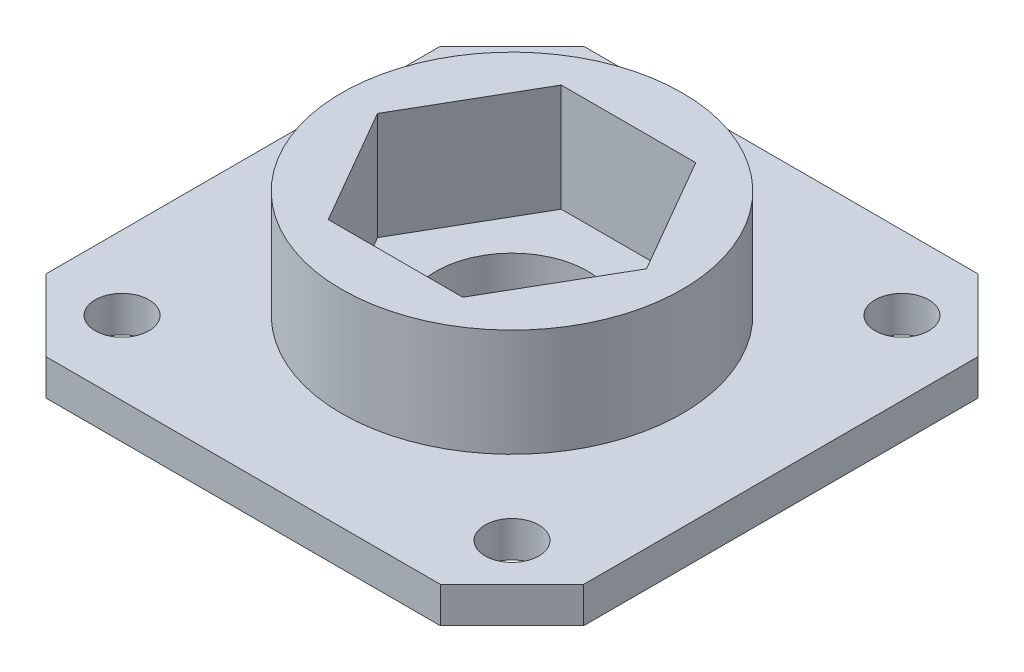
ISO-10303-21;
HEADER;
FILE_DESCRIPTION(('STEP AP214'),'2;1');
FILE_NAME('part.step','',(''),(''),'','','');
FILE_SCHEMA(('AUTOMOTIVE_DESIGN { 1 0 10303 214 1 1 1 1 }'));
ENDSEC;
DATA;
#1=APPLICATION_CONTEXT('core data for automotive mechanical design processes');
#2=APPLICATION_PROTOCOL_DEFINITION('international standard','automotive_design',2000,#1);
#3=PRODUCT_CONTEXT('',#1,'mechanical');
#4=PRODUCT('Part','Part','',(#3));
#5=PRODUCT_RELATED_PRODUCT_CATEGORY('part','',(#4));
#6=PRODUCT_DEFINITION_FORMATION('','',#4);
#7=PRODUCT_DEFINITION_CONTEXT('part definition',#1,'design');
#8=PRODUCT_DEFINITION('design','',#6,#7);
#9=PRODUCT_DEFINITION_SHAPE('','',#8);
#10=(LENGTH_UNIT() NAMED_UNIT(*) SI_UNIT(.MILLI.,.METRE.));
#11=(NAMED_UNIT(*) PLANE_ANGLE_UNIT() SI_UNIT($,.RADIAN.));
#12=(NAMED_UNIT(*) SI_UNIT($,.STERADIAN.) SOLID_ANGLE_UNIT());
#13=UNCERTAINTY_MEASURE_WITH_UNIT(LENGTH_MEASURE(1.E-05),#10,'distance_accuracy_value','');
#14=(GEOMETRIC_REPRESENTATION_CONTEXT(3) GLOBAL_UNCERTAINTY_ASSIGNED_CONTEXT((#13)) GLOBAL_UNIT_ASSIGNED_CONTEXT((#10,
#11,#12)) REPRESENTATION_CONTEXT('',''));
#15=CARTESIAN_POINT('',(0.,0.,0.));
#16=DIRECTION('',(0.,0.,1.));
#17=DIRECTION('',(1.,0.,0.));
#18=AXIS2_PLACEMENT_3D('',#15,#16,#17);
#19=CARTESIAN_POINT('',(-15.,2.,-15.));
#20=DIRECTION('',(0.,-1.,0.));
#21=DIRECTION('',(0.,0.,-1.));
#22=AXIS2_PLACEMENT_3D('',#19,#20,#21);
#23=PLANE('',#22);
#24=CARTESIAN_POINT('',(10.8786796564404,2.,-10.8786796564403));
#25=DIRECTION('',(0.,1.,0.));
#26=DIRECTION('',(0.,0.,1.));
#27=AXIS2_PLACEMENT_3D('',#24,#25,#26);
#28=CIRCLE('',#27,1.5);
#29=CARTESIAN_POINT('',(10.8786796564404,2.,-9.37867965644035));
#30=VERTEX_POINT('',#29);
#31=EDGE_CURVE('E211',#30,#30,#28,.T.);
#32=ORIENTED_EDGE('',*,*,#31,.F.);
#33=EDGE_LOOP('',(#32));
#34=FACE_BOUND('',#33,.T.);
#35=CARTESIAN_POINT('',(-10.8786796564403,2.,10.8786796564404));
#36=DIRECTION('',(0.,1.,0.));
#37=DIRECTION('',(0.,0.,1.));
#38=AXIS2_PLACEMENT_3D('',#35,#36,#37);
#39=CIRCLE('',#38,1.5);
#40=CARTESIAN_POINT('',(-10.8786796564403,2.,12.3786796564404));
#41=VERTEX_POINT('',#40);
#42=EDGE_CURVE('E199',#41,#41,#39,.T.);
#43=ORIENTED_EDGE('',*,*,#42,.F.);
#44=EDGE_LOOP('',(#43));
#45=FACE_BOUND('',#44,.T.);
#46=DIRECTION('',(0.,0.,1.));
#47=VECTOR('',#46,1.);
#48=CARTESIAN_POINT('',(-15.,2.,11.));
#49=LINE('',#48,#47);
#50=CARTESIAN_POINT('',(-15.,2.,-11.));
#51=VERTEX_POINT('',#50);
#52=CARTESIAN_POINT('',(-15.,2.,11.));
#53=VERTEX_POINT('',#52);
#54=EDGE_CURVE('E158',#51,#53,#49,.T.);
#55=ORIENTED_EDGE('',*,*,#54,.T.);
#56=DIRECTION('',(0.707106781186548,0.,0.707106781186548));
#57=VECTOR('',#56,1.);
#58=CARTESIAN_POINT('',(-15.,2.,11.));
#59=LINE('',#58,#57);
#60=CARTESIAN_POINT('',(-11.,2.,15.));
#61=VERTEX_POINT('',#60);
#62=EDGE_CURVE('E99',#53,#61,#59,.T.);
#63=ORIENTED_EDGE('',*,*,#62,.T.);
#64=DIRECTION('',(1.,0.,0.));
#65=VECTOR('',#64,1.);
#66=CARTESIAN_POINT('',(-11.,2.,15.));
#67=LINE('',#66,#65);
#68=CARTESIAN_POINT('',(11.,2.,15.));
#69=VERTEX_POINT('',#68);
#70=EDGE_CURVE('E190',#61,#69,#67,.T.);
#71=ORIENTED_EDGE('',*,*,#70,.T.);
#72=DIRECTION('',(0.707106781186548,0.,-0.707106781186547));
#73=VECTOR('',#72,1.);
#74=CARTESIAN_POINT('',(11.,2.,15.));
#75=LINE('',#74,#73);
#76=CARTESIAN_POINT('',(15.,2.,11.));
#77=VERTEX_POINT('',#76);
#78=EDGE_CURVE('E189',#69,#77,#75,.T.);
#79=ORIENTED_EDGE('',*,*,#78,.T.);
#80=DIRECTION('',(0.,0.,-1.));
#81=VECTOR('',#80,1.);
#82=CARTESIAN_POINT('',(15.,2.,11.));
#83=LINE('',#82,#81);
#84=CARTESIAN_POINT('',(15.,2.,-11.));
#85=VERTEX_POINT('',#84);
#86=EDGE_CURVE('E121',#77,#85,#83,.T.);
#87=ORIENTED_EDGE('',*,*,#86,.T.);
#88=DIRECTION('',(-0.707106781186548,0.,-0.707106781186548));
#89=VECTOR('',#88,1.);
#90=CARTESIAN_POINT('',(11.,2.,-15.));
#91=LINE('',#90,#89);
#92=CARTESIAN_POINT('',(11.,2.,-15.));
#93=VERTEX_POINT('',#92);
#94=EDGE_CURVE('E114',#85,#93,#91,.T.);
#95=ORIENTED_EDGE('',*,*,#94,.T.);
#96=DIRECTION('',(-1.,0.,0.));
#97=VECTOR('',#96,1.);
#98=CARTESIAN_POINT('',(-11.,2.,-15.));
#99=LINE('',#98,#97);
#100=CARTESIAN_POINT('',(-11.,2.,-15.));
#101=VERTEX_POINT('',#100);
#102=EDGE_CURVE('E118',#93,#101,#99,.T.);
#103=ORIENTED_EDGE('',*,*,#102,.T.);
#104=DIRECTION('',(-0.707106781186548,0.,0.707106781186548));
#105=VECTOR('',#104,1.);
#106=CARTESIAN_POINT('',(-15.,2.,-11.));
#107=LINE('',#106,#105);
#108=EDGE_CURVE('E57',#101,#51,#107,.T.);
#109=ORIENTED_EDGE('',*,*,#108,.T.);
#110=EDGE_LOOP('',(#55,#63,#71,#79,#87,#95,#103,#109));
#111=FACE_BOUND('',#110,.T.);
#112=CARTESIAN_POINT('',(-10.8786796564403,2.,-10.8786796564403));
#113=DIRECTION('',(0.,1.,0.));
#114=DIRECTION('',(0.,0.,1.));
#115=AXIS2_PLACEMENT_3D('',#112,#113,#114);
#116=CIRCLE('',#115,1.5);
#117=CARTESIAN_POINT('',(-10.8786796564403,2.,-9.37867965644035));
#118=VERTEX_POINT('',#117);
#119=EDGE_CURVE('E205',#118,#118,#116,.T.);
#120=ORIENTED_EDGE('',*,*,#119,.F.);
#121=EDGE_LOOP('',(#120));
#122=FACE_BOUND('',#121,.T.);
#123=CARTESIAN_POINT('',(10.8786796564404,2.,10.8786796564404));
#124=DIRECTION('',(0.,1.,0.));
#125=DIRECTION('',(0.,0.,1.));
#126=AXIS2_PLACEMENT_3D('',#123,#124,#125);
#127=CIRCLE('',#126,1.5);
#128=CARTESIAN_POINT('',(10.8786796564404,2.,12.3786796564404));
#129=VERTEX_POINT('',#128);
#130=EDGE_CURVE('E217',#129,#129,#127,.T.);
#131=ORIENTED_EDGE('',*,*,#130,.F.);
#132=EDGE_LOOP('',(#131));
#133=FACE_BOUND('',#132,.T.);
#134=CARTESIAN_POINT('',(0.,2.,0.));
#135=DIRECTION('',(0.,-1.,0.));
#136=DIRECTION('',(0.,0.,-1.));
#137=AXIS2_PLACEMENT_3D('',#134,#135,#136);
#138=CIRCLE('',#137,9.50000000000001);
#139=CARTESIAN_POINT('',(0.,2.,-9.50000000000001));
#140=VERTEX_POINT('',#139);
#141=EDGE_CURVE('E11',#140,#140,#138,.F.);
#142=ORIENTED_EDGE('',*,*,#141,.F.);
#143=EDGE_LOOP('',(#142));
#144=FACE_BOUND('',#143,.T.);
#145=ADVANCED_FACE('F33',(#34,#45,#111,#122,#133,#144),#23,.F.);
#146=DIRECTION('',(1.,0.,0.));
#147=VECTOR('',#146,1.);
#148=CARTESIAN_POINT('',(-3.75277674973257,2.,6.5));
#149=LINE('',#148,#147);
#150=CARTESIAN_POINT('',(-3.75277674973257,2.,6.5));
#151=VERTEX_POINT('',#150);
#152=CARTESIAN_POINT('',(3.75277674973257,2.,6.50000000000001));
#153=VERTEX_POINT('',#152);
#154=EDGE_CURVE('E245',#151,#153,#149,.T.);
#155=ORIENTED_EDGE('',*,*,#154,.T.);
#156=DIRECTION('',(0.5,0.,-0.866025403784439));
#157=VECTOR('',#156,1.);
#158=CARTESIAN_POINT('',(3.75277674973257,2.,6.5));
#159=LINE('',#158,#157);
#160=CARTESIAN_POINT('',(7.50555349946514,2.,0.));
#161=VERTEX_POINT('',#160);
#162=EDGE_CURVE('E261',#153,#161,#159,.T.);
#163=ORIENTED_EDGE('',*,*,#162,.T.);
#164=DIRECTION('',(-0.5,0.,-0.866025403784438));
#165=VECTOR('',#164,1.);
#166=CARTESIAN_POINT('',(7.50555349946514,2.,0.));
#167=LINE('',#166,#165);
#168=CARTESIAN_POINT('',(3.75277674973257,2.,-6.50000000000001));
#169=VERTEX_POINT('',#168);
#170=EDGE_CURVE('E258',#161,#169,#167,.T.);
#171=ORIENTED_EDGE('',*,*,#170,.T.);
#172=DIRECTION('',(-1.,0.,0.));
#173=VECTOR('',#172,1.);
#174=CARTESIAN_POINT('',(3.75277674973257,2.,-6.50000000000001));
#175=LINE('',#174,#173);
#176=CARTESIAN_POINT('',(-3.75277674973257,2.,-6.5));
#177=VERTEX_POINT('',#176);
#178=EDGE_CURVE('E255',#169,#177,#175,.T.);
#179=ORIENTED_EDGE('',*,*,#178,.T.);
#180=DIRECTION('',(-0.5,0.,0.866025403784439));
#181=VECTOR('',#180,1.);
#182=CARTESIAN_POINT('',(-3.75277674973257,2.,-6.5));
#183=LINE('',#182,#181);
#184=CARTESIAN_POINT('',(-7.50555349946514,2.,0.));
#185=VERTEX_POINT('',#184);
#186=EDGE_CURVE('E252',#177,#185,#183,.T.);
#187=ORIENTED_EDGE('',*,*,#186,.T.);
#188=DIRECTION('',(0.5,0.,0.866025403784438));
#189=VECTOR('',#188,1.);
#190=CARTESIAN_POINT('',(-7.50555349946514,2.,0.));
#191=LINE('',#190,#189);
#192=EDGE_CURVE('E249',#185,#151,#191,.T.);
#193=ORIENTED_EDGE('',*,*,#192,.T.);
#194=EDGE_LOOP('',(#155,#163,#171,#179,#187,#193));
#195=FACE_BOUND('',#194,.T.);
#196=CARTESIAN_POINT('',(0.,2.,0.));
#197=DIRECTION('',(0.,1.,0.));
#198=DIRECTION('',(0.,0.,1.));
#199=AXIS2_PLACEMENT_3D('',#196,#197,#198);
#200=CIRCLE('',#199,4.25);
#201=CARTESIAN_POINT('',(0.,2.,4.25));
#202=VERTEX_POINT('',#201);
#203=EDGE_CURVE('E146',#202,#202,#200,.T.);
#204=ORIENTED_EDGE('',*,*,#203,.F.);
#205=EDGE_LOOP('',(#204));
#206=FACE_BOUND('',#205,.T.);
#207=ADVANCED_FACE('F317',(#195,#206),#23,.F.);
#208=CARTESIAN_POINT('',(-15.,0.,-15.));
#209=DIRECTION('',(0.,-1.,0.));
#210=DIRECTION('',(0.,0.,-1.));
#211=AXIS2_PLACEMENT_3D('',#208,#209,#210);
#212=PLANE('',#211);
#213=CARTESIAN_POINT('',(10.8786796564404,0.,-10.8786796564403));
#214=DIRECTION('',(0.,1.,0.));
#215=DIRECTION('',(0.,0.,1.));
#216=AXIS2_PLACEMENT_3D('',#213,#214,#215);
#217=CIRCLE('',#216,1.5);
#218=CARTESIAN_POINT('',(10.8786796564404,0.,-9.37867965644035));
#219=VERTEX_POINT('',#218);
#220=EDGE_CURVE('E214',#219,#219,#217,.T.);
#221=ORIENTED_EDGE('',*,*,#220,.T.);
#222=EDGE_LOOP('',(#221));
#223=FACE_BOUND('',#222,.T.);
#224=CARTESIAN_POINT('',(-10.8786796564403,0.,10.8786796564404));
#225=DIRECTION('',(0.,1.,0.));
#226=DIRECTION('',(0.,0.,1.));
#227=AXIS2_PLACEMENT_3D('',#224,#225,#226);
#228=CIRCLE('',#227,1.5);
#229=CARTESIAN_POINT('',(-10.8786796564403,0.,12.3786796564404));
#230=VERTEX_POINT('',#229);
#231=EDGE_CURVE('E202',#230,#230,#228,.T.);
#232=ORIENTED_EDGE('',*,*,#231,.T.);
#233=EDGE_LOOP('',(#232));
#234=FACE_BOUND('',#233,.T.);
#235=DIRECTION('',(0.,0.,1.));
#236=VECTOR('',#235,1.);
#237=CARTESIAN_POINT('',(-15.,0.,11.));
#238=LINE('',#237,#236);
#239=CARTESIAN_POINT('',(-15.,0.,-11.));
#240=VERTEX_POINT('',#239);
#241=CARTESIAN_POINT('',(-15.,0.,11.));
#242=VERTEX_POINT('',#241);
#243=EDGE_CURVE('E142',#240,#242,#238,.T.);
#244=ORIENTED_EDGE('',*,*,#243,.F.);
#245=DIRECTION('',(-0.707106781186548,0.,0.707106781186548));
#246=VECTOR('',#245,1.);
#247=CARTESIAN_POINT('',(-15.,0.,-11.));
#248=LINE('',#247,#246);
#249=CARTESIAN_POINT('',(-11.,0.,-15.));
#250=VERTEX_POINT('',#249);
#251=EDGE_CURVE('E90',#250,#240,#248,.T.);
#252=ORIENTED_EDGE('',*,*,#251,.F.);
#253=DIRECTION('',(-1.,0.,0.));
#254=VECTOR('',#253,1.);
#255=CARTESIAN_POINT('',(-11.,0.,-15.));
#256=LINE('',#255,#254);
#257=CARTESIAN_POINT('',(11.,0.,-15.));
#258=VERTEX_POINT('',#257);
#259=EDGE_CURVE('E155',#258,#250,#256,.T.);
#260=ORIENTED_EDGE('',*,*,#259,.F.);
#261=DIRECTION('',(-0.707106781186548,0.,-0.707106781186548));
#262=VECTOR('',#261,1.);
#263=CARTESIAN_POINT('',(11.,0.,-15.));
#264=LINE('',#263,#262);
#265=CARTESIAN_POINT('',(15.,0.,-11.));
#266=VERTEX_POINT('',#265);
#267=EDGE_CURVE('E130',#266,#258,#264,.T.);
#268=ORIENTED_EDGE('',*,*,#267,.F.);
#269=DIRECTION('',(0.,0.,-1.));
#270=VECTOR('',#269,1.);
#271=CARTESIAN_POINT('',(15.,0.,11.));
#272=LINE('',#271,#270);
#273=CARTESIAN_POINT('',(15.,0.,11.));
#274=VERTEX_POINT('',#273);
#275=EDGE_CURVE('E152',#274,#266,#272,.T.);
#276=ORIENTED_EDGE('',*,*,#275,.F.);
#277=DIRECTION('',(0.707106781186548,0.,-0.707106781186547));
#278=VECTOR('',#277,1.);
#279=CARTESIAN_POINT('',(11.,0.,15.));
#280=LINE('',#279,#278);
#281=CARTESIAN_POINT('',(11.,0.,15.));
#282=VERTEX_POINT('',#281);
#283=EDGE_CURVE('E150',#282,#274,#280,.T.);
#284=ORIENTED_EDGE('',*,*,#283,.F.);
#285=DIRECTION('',(1.,0.,0.));
#286=VECTOR('',#285,1.);
#287=CARTESIAN_POINT('',(-11.,0.,15.));
#288=LINE('',#287,#286);
#289=CARTESIAN_POINT('',(-11.,0.,15.));
#290=VERTEX_POINT('',#289);
#291=EDGE_CURVE('E148',#290,#282,#288,.T.);
#292=ORIENTED_EDGE('',*,*,#291,.F.);
#293=DIRECTION('',(0.707106781186548,0.,0.707106781186548));
#294=VECTOR('',#293,1.);
#295=CARTESIAN_POINT('',(-15.,0.,11.));
#296=LINE('',#295,#294);
#297=EDGE_CURVE('E145',#242,#290,#296,.T.);
#298=ORIENTED_EDGE('',*,*,#297,.F.);
#299=EDGE_LOOP('',(#244,#252,#260,#268,#276,#284,#292,#298));
#300=FACE_BOUND('',#299,.T.);
#301=CARTESIAN_POINT('',(0.,0.,0.));
#302=DIRECTION('',(0.,1.,0.));
#303=DIRECTION('',(0.,0.,1.));
#304=AXIS2_PLACEMENT_3D('',#301,#302,#303);
#305=CIRCLE('',#304,4.25);
#306=CARTESIAN_POINT('',(0.,0.,4.25));
#307=VERTEX_POINT('',#306);
#308=EDGE_CURVE('E196',#307,#307,#305,.T.);
#309=ORIENTED_EDGE('',*,*,#308,.T.);
#310=EDGE_LOOP('',(#309));
#311=FACE_BOUND('',#310,.T.);
#312=CARTESIAN_POINT('',(-10.8786796564403,0.,-10.8786796564403));
#313=DIRECTION('',(0.,1.,0.));
#314=DIRECTION('',(0.,0.,1.));
#315=AXIS2_PLACEMENT_3D('',#312,#313,#314);
#316=CIRCLE('',#315,1.5);
#317=CARTESIAN_POINT('',(-10.8786796564403,0.,-9.37867965644035));
#318=VERTEX_POINT('',#317);
#319=EDGE_CURVE('E208',#318,#318,#316,.T.);
#320=ORIENTED_EDGE('',*,*,#319,.T.);
#321=EDGE_LOOP('',(#320));
#322=FACE_BOUND('',#321,.T.);
#323=CARTESIAN_POINT('',(10.8786796564404,0.,10.8786796564404));
#324=DIRECTION('',(0.,1.,0.));
#325=DIRECTION('',(0.,0.,1.));
#326=AXIS2_PLACEMENT_3D('',#323,#324,#325);
#327=CIRCLE('',#326,1.5);
#328=CARTESIAN_POINT('',(10.8786796564404,0.,12.3786796564404));
#329=VERTEX_POINT('',#328);
#330=EDGE_CURVE('E220',#329,#329,#327,.T.);
#331=ORIENTED_EDGE('',*,*,#330,.T.);
#332=EDGE_LOOP('',(#331));
#333=FACE_BOUND('',#332,.T.);
#334=ADVANCED_FACE('F176',(#223,#234,#300,#311,#322,#333),#212,.T.);
#335=CARTESIAN_POINT('',(-15.,2.,11.));
#336=DIRECTION('',(1.,0.,0.));
#337=DIRECTION('',(0.,0.,-1.));
#338=AXIS2_PLACEMENT_3D('',#335,#336,#337);
#339=PLANE('',#338);
#340=ORIENTED_EDGE('',*,*,#243,.T.);
#341=DIRECTION('',(0.,-1.,0.));
#342=VECTOR('',#341,1.);
#343=CARTESIAN_POINT('',(-15.,2.,11.));
#344=LINE('',#343,#342);
#345=EDGE_CURVE('E41',#53,#242,#344,.T.);
#346=ORIENTED_EDGE('',*,*,#345,.F.);
#347=ORIENTED_EDGE('',*,*,#54,.F.);
#348=DIRECTION('',(0.,-1.,0.));
#349=VECTOR('',#348,1.);
#350=CARTESIAN_POINT('',(-15.,2.,-11.));
#351=LINE('',#350,#349);
#352=EDGE_CURVE('E138',#51,#240,#351,.T.);
#353=ORIENTED_EDGE('',*,*,#352,.T.);
#354=EDGE_LOOP('',(#340,#346,#347,#353));
#355=FACE_BOUND('',#354,.T.);
#356=ADVANCED_FACE('F35',(#355),#339,.F.);
#357=CARTESIAN_POINT('',(-15.,2.,11.));
#358=DIRECTION('',(0.707106781186547,0.,-0.707106781186547));
#359=DIRECTION('',(-0.707106781186548,0.,-0.707106781186548));
#360=AXIS2_PLACEMENT_3D('',#357,#358,#359);
#361=PLANE('',#360);
#362=ORIENTED_EDGE('',*,*,#297,.T.);
#363=DIRECTION('',(0.,-1.,0.));
#364=VECTOR('',#363,1.);
#365=CARTESIAN_POINT('',(-11.,2.,15.));
#366=LINE('',#365,#364);
#367=EDGE_CURVE('E168',#61,#290,#366,.T.);
#368=ORIENTED_EDGE('',*,*,#367,.F.);
#369=ORIENTED_EDGE('',*,*,#62,.F.);
#370=ORIENTED_EDGE('',*,*,#345,.T.);
#371=EDGE_LOOP('',(#362,#368,#369,#370));
#372=FACE_BOUND('',#371,.T.);
#373=ADVANCED_FACE('F171',(#372),#361,.F.);
#374=CARTESIAN_POINT('',(-11.,2.,15.));
#375=DIRECTION('',(0.,0.,-1.));
#376=DIRECTION('',(-1.,0.,0.));
#377=AXIS2_PLACEMENT_3D('',#374,#375,#376);
#378=PLANE('',#377);
#379=ORIENTED_EDGE('',*,*,#291,.T.);
#380=DIRECTION('',(0.,-1.,0.));
#381=VECTOR('',#380,1.);
#382=CARTESIAN_POINT('',(11.,2.,15.));
#383=LINE('',#382,#381);
#384=EDGE_CURVE('E165',#69,#282,#383,.T.);
#385=ORIENTED_EDGE('',*,*,#384,.F.);
#386=ORIENTED_EDGE('',*,*,#70,.F.);
#387=ORIENTED_EDGE('',*,*,#367,.T.);
#388=EDGE_LOOP('',(#379,#385,#386,#387));
#389=FACE_BOUND('',#388,.T.);
#390=ADVANCED_FACE('F183',(#389),#378,.F.);
#391=CARTESIAN_POINT('',(11.,2.,15.));
#392=DIRECTION('',(-0.707106781186547,0.,-0.707106781186548));
#393=DIRECTION('',(-0.707106781186548,0.,0.707106781186547));
#394=AXIS2_PLACEMENT_3D('',#391,#392,#393);
#395=PLANE('',#394);
#396=ORIENTED_EDGE('',*,*,#283,.T.);
#397=DIRECTION('',(0.,-1.,0.));
#398=VECTOR('',#397,1.);
#399=CARTESIAN_POINT('',(15.,2.,11.));
#400=LINE('',#399,#398);
#401=EDGE_CURVE('E162',#77,#274,#400,.T.);
#402=ORIENTED_EDGE('',*,*,#401,.F.);
#403=ORIENTED_EDGE('',*,*,#78,.F.);
#404=ORIENTED_EDGE('',*,*,#384,.T.);
#405=EDGE_LOOP('',(#396,#402,#403,#404));
#406=FACE_BOUND('',#405,.T.);
#407=ADVANCED_FACE('F187',(#406),#395,.F.);
#408=CARTESIAN_POINT('',(15.,2.,11.));
#409=DIRECTION('',(-1.,0.,0.));
#410=DIRECTION('',(0.,0.,1.));
#411=AXIS2_PLACEMENT_3D('',#408,#409,#410);
#412=PLANE('',#411);
#413=ORIENTED_EDGE('',*,*,#275,.T.);
#414=DIRECTION('',(0.,-1.,0.));
#415=VECTOR('',#414,1.);
#416=CARTESIAN_POINT('',(15.,2.,-11.));
#417=LINE('',#416,#415);
#418=EDGE_CURVE('E133',#85,#266,#417,.T.);
#419=ORIENTED_EDGE('',*,*,#418,.F.);
#420=ORIENTED_EDGE('',*,*,#86,.F.);
#421=ORIENTED_EDGE('',*,*,#401,.T.);
#422=EDGE_LOOP('',(#413,#419,#420,#421));
#423=FACE_BOUND('',#422,.T.);
#424=ADVANCED_FACE('F355',(#423),#412,.F.);
#425=CARTESIAN_POINT('',(11.,2.,-15.));
#426=DIRECTION('',(-0.707106781186547,0.,0.707106781186547));
#427=DIRECTION('',(0.707106781186548,0.,0.707106781186548));
#428=AXIS2_PLACEMENT_3D('',#425,#426,#427);
#429=PLANE('',#428);
#430=ORIENTED_EDGE('',*,*,#267,.T.);
#431=DIRECTION('',(0.,-1.,0.));
#432=VECTOR('',#431,1.);
#433=CARTESIAN_POINT('',(11.,2.,-15.));
#434=LINE('',#433,#432);
#435=EDGE_CURVE('E127',#93,#258,#434,.T.);
#436=ORIENTED_EDGE('',*,*,#435,.F.);
#437=ORIENTED_EDGE('',*,*,#94,.F.);
#438=ORIENTED_EDGE('',*,*,#418,.T.);
#439=EDGE_LOOP('',(#430,#436,#437,#438));
#440=FACE_BOUND('',#439,.T.);
#441=ADVANCED_FACE('F128',(#440),#429,.F.);
#442=CARTESIAN_POINT('',(-11.,2.,-15.));
#443=DIRECTION('',(0.,0.,1.));
#444=DIRECTION('',(1.,0.,0.));
#445=AXIS2_PLACEMENT_3D('',#442,#443,#444);
#446=PLANE('',#445);
#447=ORIENTED_EDGE('',*,*,#259,.T.);
#448=DIRECTION('',(0.,-1.,0.));
#449=VECTOR('',#448,1.);
#450=CARTESIAN_POINT('',(-11.,2.,-15.));
#451=LINE('',#450,#449);
#452=EDGE_CURVE('E134',#101,#250,#451,.T.);
#453=ORIENTED_EDGE('',*,*,#452,.F.);
#454=ORIENTED_EDGE('',*,*,#102,.F.);
#455=ORIENTED_EDGE('',*,*,#435,.T.);
#456=EDGE_LOOP('',(#447,#453,#454,#455));
#457=FACE_BOUND('',#456,.T.);
#458=ADVANCED_FACE('F136',(#457),#446,.F.);
#459=CARTESIAN_POINT('',(-15.,2.,-11.));
#460=DIRECTION('',(0.707106781186547,0.,0.707106781186547));
#461=DIRECTION('',(0.707106781186548,0.,-0.707106781186548));
#462=AXIS2_PLACEMENT_3D('',#459,#460,#461);
#463=PLANE('',#462);
#464=ORIENTED_EDGE('',*,*,#251,.T.);
#465=ORIENTED_EDGE('',*,*,#352,.F.);
#466=ORIENTED_EDGE('',*,*,#108,.F.);
#467=ORIENTED_EDGE('',*,*,#452,.T.);
#468=EDGE_LOOP('',(#464,#465,#466,#467));
#469=FACE_BOUND('',#468,.T.);
#470=ADVANCED_FACE('F348',(#469),#463,.F.);
#471=CARTESIAN_POINT('',(0.,2.,0.));
#472=DIRECTION('',(0.,-1.,0.));
#473=DIRECTION('',(0.,0.,-1.));
#474=AXIS2_PLACEMENT_3D('',#471,#472,#473);
#475=CYLINDRICAL_SURFACE('',#474,4.25);
#476=ORIENTED_EDGE('',*,*,#203,.T.);
#477=EDGE_LOOP('',(#476));
#478=FACE_BOUND('',#477,.T.);
#479=ORIENTED_EDGE('',*,*,#308,.F.);
#480=EDGE_LOOP('',(#479));
#481=FACE_BOUND('',#480,.T.);
#482=ADVANCED_FACE('F343',(#478,#481),#475,.F.);
#483=CARTESIAN_POINT('',(-10.8786796564403,2.,10.8786796564404));
#484=DIRECTION('',(0.,-1.,0.));
#485=DIRECTION('',(0.,0.,-1.));
#486=AXIS2_PLACEMENT_3D('',#483,#484,#485);
#487=CYLINDRICAL_SURFACE('',#486,1.5);
#488=ORIENTED_EDGE('',*,*,#42,.T.);
#489=EDGE_LOOP('',(#488));
#490=FACE_BOUND('',#489,.T.);
#491=ORIENTED_EDGE('',*,*,#231,.F.);
#492=EDGE_LOOP('',(#491));
#493=FACE_BOUND('',#492,.T.);
#494=ADVANCED_FACE('F455',(#490,#493),#487,.F.);
#495=CARTESIAN_POINT('',(-10.8786796564403,2.,-10.8786796564403));
#496=DIRECTION('',(0.,-1.,0.));
#497=DIRECTION('',(0.,0.,-1.));
#498=AXIS2_PLACEMENT_3D('',#495,#496,#497);
#499=CYLINDRICAL_SURFACE('',#498,1.5);
#500=ORIENTED_EDGE('',*,*,#119,.T.);
#501=EDGE_LOOP('',(#500));
#502=FACE_BOUND('',#501,.T.);
#503=ORIENTED_EDGE('',*,*,#319,.F.);
#504=EDGE_LOOP('',(#503));
#505=FACE_BOUND('',#504,.T.);
#506=ADVANCED_FACE('F452',(#502,#505),#499,.F.);
#507=CARTESIAN_POINT('',(10.8786796564404,2.,-10.8786796564403));
#508=DIRECTION('',(0.,-1.,0.));
#509=DIRECTION('',(0.,0.,-1.));
#510=AXIS2_PLACEMENT_3D('',#507,#508,#509);
#511=CYLINDRICAL_SURFACE('',#510,1.5);
#512=ORIENTED_EDGE('',*,*,#31,.T.);
#513=EDGE_LOOP('',(#512));
#514=FACE_BOUND('',#513,.T.);
#515=ORIENTED_EDGE('',*,*,#220,.F.);
#516=EDGE_LOOP('',(#515));
#517=FACE_BOUND('',#516,.T.);
#518=ADVANCED_FACE('F448',(#514,#517),#511,.F.);
#519=CARTESIAN_POINT('',(10.8786796564404,2.,10.8786796564404));
#520=DIRECTION('',(0.,-1.,0.));
#521=DIRECTION('',(0.,0.,-1.));
#522=AXIS2_PLACEMENT_3D('',#519,#520,#521);
#523=CYLINDRICAL_SURFACE('',#522,1.5);
#524=ORIENTED_EDGE('',*,*,#130,.T.);
#525=EDGE_LOOP('',(#524));
#526=FACE_BOUND('',#525,.T.);
#527=ORIENTED_EDGE('',*,*,#330,.F.);
#528=EDGE_LOOP('',(#527));
#529=FACE_BOUND('',#528,.T.);
#530=ADVANCED_FACE('F389',(#526,#529),#523,.F.);
#531=CARTESIAN_POINT('',(0.,8.,0.));
#532=DIRECTION('',(0.,1.,0.));
#533=DIRECTION('',(0.,0.,1.));
#534=AXIS2_PLACEMENT_3D('',#531,#532,#533);
#535=PLANE('',#534);
#536=CARTESIAN_POINT('',(0.,8.,0.));
#537=DIRECTION('',(0.,1.,0.));
#538=DIRECTION('',(0.,0.,1.));
#539=AXIS2_PLACEMENT_3D('',#536,#537,#538);
#540=CIRCLE('',#539,9.50000000000001);
#541=CARTESIAN_POINT('',(0.,8.,9.50000000000001));
#542=VERTEX_POINT('',#541);
#543=EDGE_CURVE('E223',#542,#542,#540,.T.);
#544=ORIENTED_EDGE('',*,*,#543,.T.);
#545=EDGE_LOOP('',(#544));
#546=FACE_BOUND('',#545,.T.);
#547=DIRECTION('',(-0.5,0.,-0.866025403784438));
#548=VECTOR('',#547,1.);
#549=CARTESIAN_POINT('',(7.50555349946514,8.,0.));
#550=LINE('',#549,#548);
#551=CARTESIAN_POINT('',(7.50555349946514,8.,0.));
#552=VERTEX_POINT('',#551);
#553=CARTESIAN_POINT('',(3.75277674973257,8.,-6.50000000000001));
#554=VERTEX_POINT('',#553);
#555=EDGE_CURVE('E274',#552,#554,#550,.T.);
#556=ORIENTED_EDGE('',*,*,#555,.F.);
#557=DIRECTION('',(0.5,0.,-0.866025403784439));
#558=VECTOR('',#557,1.);
#559=CARTESIAN_POINT('',(3.75277674973257,8.,6.5));
#560=LINE('',#559,#558);
#561=CARTESIAN_POINT('',(3.75277674973257,8.,6.5));
#562=VERTEX_POINT('',#561);
#563=EDGE_CURVE('E248',#562,#552,#560,.T.);
#564=ORIENTED_EDGE('',*,*,#563,.F.);
#565=DIRECTION('',(1.,0.,0.));
#566=VECTOR('',#565,1.);
#567=CARTESIAN_POINT('',(-3.75277674973257,8.,6.5));
#568=LINE('',#567,#566);
#569=CARTESIAN_POINT('',(-3.75277674973257,8.,6.5));
#570=VERTEX_POINT('',#569);
#571=EDGE_CURVE('E244',#570,#562,#568,.T.);
#572=ORIENTED_EDGE('',*,*,#571,.F.);
#573=DIRECTION('',(0.5,0.,0.866025403784438));
#574=VECTOR('',#573,1.);
#575=CARTESIAN_POINT('',(-7.50555349946514,8.,0.));
#576=LINE('',#575,#574);
#577=CARTESIAN_POINT('',(-7.50555349946514,8.,0.));
#578=VERTEX_POINT('',#577);
#579=EDGE_CURVE('E265',#578,#570,#576,.T.);
#580=ORIENTED_EDGE('',*,*,#579,.F.);
#581=DIRECTION('',(-0.5,0.,0.866025403784439));
#582=VECTOR('',#581,1.);
#583=CARTESIAN_POINT('',(-3.75277674973257,8.,-6.5));
#584=LINE('',#583,#582);
#585=CARTESIAN_POINT('',(-3.75277674973257,8.,-6.5));
#586=VERTEX_POINT('',#585);
#587=EDGE_CURVE('E268',#586,#578,#584,.T.);
#588=ORIENTED_EDGE('',*,*,#587,.F.);
#589=DIRECTION('',(-1.,0.,0.));
#590=VECTOR('',#589,1.);
#591=CARTESIAN_POINT('',(3.75277674973257,8.,-6.50000000000001));
#592=LINE('',#591,#590);
#593=EDGE_CURVE('E271',#554,#586,#592,.T.);
#594=ORIENTED_EDGE('',*,*,#593,.F.);
#595=EDGE_LOOP('',(#556,#564,#572,#580,#588,#594));
#596=FACE_BOUND('',#595,.T.);
#597=ADVANCED_FACE('F296',(#546,#596),#535,.T.);
#598=CARTESIAN_POINT('',(0.,8.,0.));
#599=DIRECTION('',(0.,-1.,0.));
#600=DIRECTION('',(0.,0.,-1.));
#601=AXIS2_PLACEMENT_3D('',#598,#599,#600);
#602=CYLINDRICAL_SURFACE('',#601,9.50000000000001);
#603=ORIENTED_EDGE('',*,*,#543,.F.);
#604=EDGE_LOOP('',(#603));
#605=FACE_BOUND('',#604,.T.);
#606=ORIENTED_EDGE('',*,*,#141,.T.);
#607=EDGE_LOOP('',(#606));
#608=FACE_BOUND('',#607,.T.);
#609=ADVANCED_FACE('F388',(#605,#608),#602,.T.);
#610=CARTESIAN_POINT('',(3.75277674973257,8.,6.5));
#611=DIRECTION('',(-0.866025403784439,0.,-0.5));
#612=DIRECTION('',(-0.5,0.,0.866025403784439));
#613=AXIS2_PLACEMENT_3D('',#610,#611,#612);
#614=PLANE('',#613);
#615=ORIENTED_EDGE('',*,*,#162,.F.);
#616=DIRECTION('',(0.,-1.,0.));
#617=VECTOR('',#616,1.);
#618=CARTESIAN_POINT('',(3.75277674973257,8.,6.5));
#619=LINE('',#618,#617);
#620=EDGE_CURVE('E48',#562,#153,#619,.T.);
#621=ORIENTED_EDGE('',*,*,#620,.F.);
#622=ORIENTED_EDGE('',*,*,#563,.T.);
#623=DIRECTION('',(0.,-1.,0.));
#624=VECTOR('',#623,1.);
#625=CARTESIAN_POINT('',(7.50555349946514,8.,0.));
#626=LINE('',#625,#624);
#627=EDGE_CURVE('E228',#552,#161,#626,.T.);
#628=ORIENTED_EDGE('',*,*,#627,.T.);
#629=EDGE_LOOP('',(#615,#621,#622,#628));
#630=FACE_BOUND('',#629,.T.);
#631=ADVANCED_FACE('F282',(#630),#614,.T.);
#632=CARTESIAN_POINT('',(7.50555349946514,8.,0.));
#633=DIRECTION('',(-0.866025403784439,0.,0.5));
#634=DIRECTION('',(0.5,0.,0.866025403784439));
#635=AXIS2_PLACEMENT_3D('',#632,#633,#634);
#636=PLANE('',#635);
#637=ORIENTED_EDGE('',*,*,#170,.F.);
#638=ORIENTED_EDGE('',*,*,#627,.F.);
#639=ORIENTED_EDGE('',*,*,#555,.T.);
#640=DIRECTION('',(0.,-1.,0.));
#641=VECTOR('',#640,1.);
#642=CARTESIAN_POINT('',(3.75277674973257,8.,-6.50000000000001));
#643=LINE('',#642,#641);
#644=EDGE_CURVE('E231',#554,#169,#643,.T.);
#645=ORIENTED_EDGE('',*,*,#644,.T.);
#646=EDGE_LOOP('',(#637,#638,#639,#645));
#647=FACE_BOUND('',#646,.T.);
#648=ADVANCED_FACE('F293',(#647),#636,.T.);
#649=CARTESIAN_POINT('',(3.75277674973257,8.,-6.50000000000001));
#650=DIRECTION('',(0.,0.,1.));
#651=DIRECTION('',(1.,0.,0.));
#652=AXIS2_PLACEMENT_3D('',#649,#650,#651);
#653=PLANE('',#652);
#654=ORIENTED_EDGE('',*,*,#178,.F.);
#655=ORIENTED_EDGE('',*,*,#644,.F.);
#656=ORIENTED_EDGE('',*,*,#593,.T.);
#657=DIRECTION('',(0.,-1.,0.));
#658=VECTOR('',#657,1.);
#659=CARTESIAN_POINT('',(-3.75277674973257,8.,-6.5));
#660=LINE('',#659,#658);
#661=EDGE_CURVE('E234',#586,#177,#660,.T.);
#662=ORIENTED_EDGE('',*,*,#661,.T.);
#663=EDGE_LOOP('',(#654,#655,#656,#662));
#664=FACE_BOUND('',#663,.T.);
#665=ADVANCED_FACE('F304',(#664),#653,.T.);
#666=CARTESIAN_POINT('',(-3.75277674973257,8.,-6.5));
#667=DIRECTION('',(0.866025403784439,0.,0.5));
#668=DIRECTION('',(0.5,0.,-0.866025403784439));
#669=AXIS2_PLACEMENT_3D('',#666,#667,#668);
#670=PLANE('',#669);
#671=ORIENTED_EDGE('',*,*,#186,.F.);
#672=ORIENTED_EDGE('',*,*,#661,.F.);
#673=ORIENTED_EDGE('',*,*,#587,.T.);
#674=DIRECTION('',(0.,-1.,0.));
#675=VECTOR('',#674,1.);
#676=CARTESIAN_POINT('',(-7.50555349946514,8.,0.));
#677=LINE('',#676,#675);
#678=EDGE_CURVE('E237',#578,#185,#677,.T.);
#679=ORIENTED_EDGE('',*,*,#678,.T.);
#680=EDGE_LOOP('',(#671,#672,#673,#679));
#681=FACE_BOUND('',#680,.T.);
#682=ADVANCED_FACE('F310',(#681),#670,.T.);
#683=CARTESIAN_POINT('',(-7.50555349946514,8.,0.));
#684=DIRECTION('',(0.866025403784439,0.,-0.5));
#685=DIRECTION('',(-0.5,0.,-0.866025403784439));
#686=AXIS2_PLACEMENT_3D('',#683,#684,#685);
#687=PLANE('',#686);
#688=ORIENTED_EDGE('',*,*,#192,.F.);
#689=ORIENTED_EDGE('',*,*,#678,.F.);
#690=ORIENTED_EDGE('',*,*,#579,.T.);
#691=DIRECTION('',(0.,-1.,0.));
#692=VECTOR('',#691,1.);
#693=CARTESIAN_POINT('',(-3.75277674973257,8.,6.5));
#694=LINE('',#693,#692);
#695=EDGE_CURVE('E240',#570,#151,#694,.T.);
#696=ORIENTED_EDGE('',*,*,#695,.T.);
#697=EDGE_LOOP('',(#688,#689,#690,#696));
#698=FACE_BOUND('',#697,.T.);
#699=ADVANCED_FACE('F325',(#698),#687,.T.);
#700=CARTESIAN_POINT('',(-3.75277674973257,8.,6.5));
#701=DIRECTION('',(0.,0.,-1.));
#702=DIRECTION('',(-1.,0.,0.));
#703=AXIS2_PLACEMENT_3D('',#700,#701,#702);
#704=PLANE('',#703);
#705=ORIENTED_EDGE('',*,*,#154,.F.);
#706=ORIENTED_EDGE('',*,*,#695,.F.);
#707=ORIENTED_EDGE('',*,*,#571,.T.);
#708=ORIENTED_EDGE('',*,*,#620,.T.);
#709=EDGE_LOOP('',(#705,#706,#707,#708));
#710=FACE_BOUND('',#709,.T.);
#711=ADVANCED_FACE('F326',(#710),#704,.T.);
#712=CLOSED_SHELL('',(#145,#207,#334,#356,#373,#390,#407,#424,#441,#458,#470,#482,#494,#506,
#518,#530,#597,#609,#631,#648,#665,#682,#699,#711));
#713=MANIFOLD_SOLID_BREP('B2',#712);
#714=ADVANCED_BREP_SHAPE_REPRESENTATION('',(#18,#713),#14);
#715=SHAPE_DEFINITION_REPRESENTATION(#9,#714);
ENDSEC;
END-ISO-10303-21;
